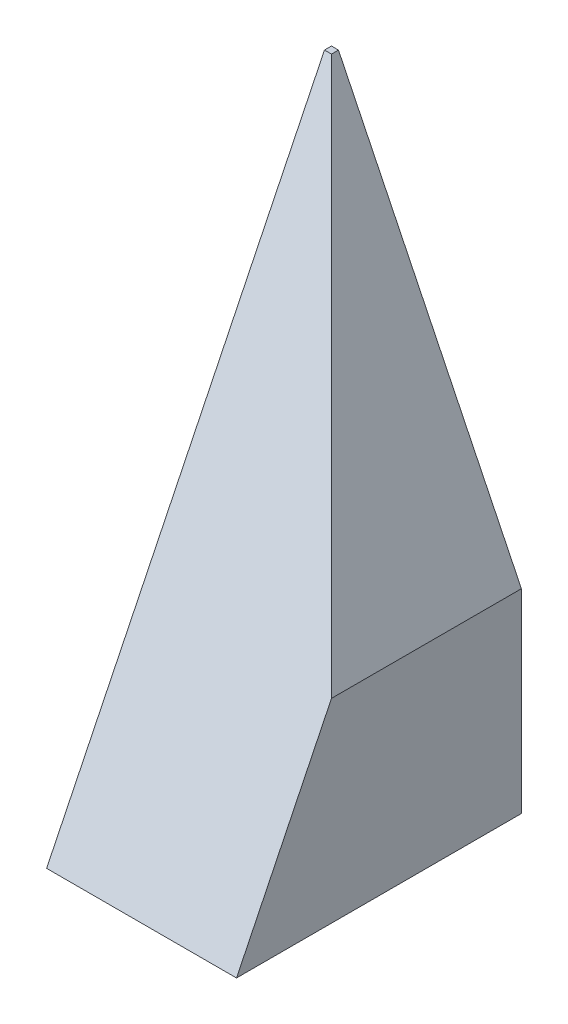
ISO-10303-21;
HEADER;
FILE_DESCRIPTION(('STEP AP214'),'2;1');
FILE_NAME('part.step','',(''),(''),'','','');
FILE_SCHEMA(('AUTOMOTIVE_DESIGN { 1 0 10303 214 1 1 1 1 }'));
ENDSEC;
DATA;
#1=APPLICATION_CONTEXT('core data for automotive mechanical design processes');
#2=APPLICATION_PROTOCOL_DEFINITION('international standard','automotive_design',2000,#1);
#3=PRODUCT_CONTEXT('',#1,'mechanical');
#4=PRODUCT('Part','Part','',(#3));
#5=PRODUCT_RELATED_PRODUCT_CATEGORY('part','',(#4));
#6=PRODUCT_DEFINITION_FORMATION('','',#4);
#7=PRODUCT_DEFINITION_CONTEXT('part definition',#1,'design');
#8=PRODUCT_DEFINITION('design','',#6,#7);
#9=PRODUCT_DEFINITION_SHAPE('','',#8);
#10=(LENGTH_UNIT() NAMED_UNIT(*) SI_UNIT(.MILLI.,.METRE.));
#11=(NAMED_UNIT(*) PLANE_ANGLE_UNIT() SI_UNIT($,.RADIAN.));
#12=(NAMED_UNIT(*) SI_UNIT($,.STERADIAN.) SOLID_ANGLE_UNIT());
#13=UNCERTAINTY_MEASURE_WITH_UNIT(LENGTH_MEASURE(1.E-05),#10,'distance_accuracy_value','');
#14=(GEOMETRIC_REPRESENTATION_CONTEXT(3) GLOBAL_UNCERTAINTY_ASSIGNED_CONTEXT((#13)) GLOBAL_UNIT_ASSIGNED_CONTEXT((#10,
#11,#12)) REPRESENTATION_CONTEXT('',''));
#15=CARTESIAN_POINT('',(0.,0.,0.));
#16=DIRECTION('',(0.,0.,1.));
#17=DIRECTION('',(1.,0.,0.));
#18=AXIS2_PLACEMENT_3D('',#15,#16,#17);
#19=CARTESIAN_POINT('',(0.,60.,0.));
#20=DIRECTION('',(0.,0.,1.));
#21=DIRECTION('',(1.,0.,0.));
#22=AXIS2_PLACEMENT_3D('',#19,#20,#21);
#23=PLANE('',#22);
#24=DIRECTION('',(0.,-1.,0.));
#25=VECTOR('',#24,1.);
#26=CARTESIAN_POINT('',(20.,101.,0.));
#27=LINE('',#26,#25);
#28=CARTESIAN_POINT('',(20.,20.5030384157926,0.));
#29=VERTEX_POINT('',#28);
#30=CARTESIAN_POINT('',(20.,0.,0.));
#31=VERTEX_POINT('',#30);
#32=EDGE_CURVE('E91',#29,#31,#27,.T.);
#33=ORIENTED_EDGE('',*,*,#32,.T.);
#34=DIRECTION('',(-1.,0.,0.));
#35=VECTOR('',#34,1.);
#36=CARTESIAN_POINT('',(0.,0.,0.));
#37=LINE('',#36,#35);
#38=CARTESIAN_POINT('',(0.,0.,0.));
#39=VERTEX_POINT('',#38);
#40=EDGE_CURVE('E100',#31,#39,#37,.T.);
#41=ORIENTED_EDGE('',*,*,#40,.T.);
#42=DIRECTION('',(0.,-1.,0.));
#43=VECTOR('',#42,1.);
#44=CARTESIAN_POINT('',(0.,60.,0.));
#45=LINE('',#44,#43);
#46=CARTESIAN_POINT('',(0.,60.,0.));
#47=VERTEX_POINT('',#46);
#48=EDGE_CURVE('E122',#47,#39,#45,.T.);
#49=ORIENTED_EDGE('',*,*,#48,.F.);
#50=DIRECTION('',(-1.,0.,0.));
#51=VECTOR('',#50,1.);
#52=CARTESIAN_POINT('',(0.,60.,0.));
#53=LINE('',#52,#51);
#54=CARTESIAN_POINT('',(0.736044686048265,60.,0.));
#55=VERTEX_POINT('',#54);
#56=EDGE_CURVE('E117',#55,#47,#53,.T.);
#57=ORIENTED_EDGE('',*,*,#56,.F.);
#58=DIRECTION('',(0.438371146789075,-0.898794046299168,0.));
#59=VECTOR('',#58,1.);
#60=CARTESIAN_POINT('',(0.736044686048265,60.,0.));
#61=LINE('',#60,#59);
#62=EDGE_CURVE('E51',#55,#29,#61,.T.);
#63=ORIENTED_EDGE('',*,*,#62,.T.);
#64=EDGE_LOOP('',(#33,#41,#49,#57,#63));
#65=FACE_BOUND('',#64,.T.);
#66=ADVANCED_FACE('F41',(#65),#23,.F.);
#67=CARTESIAN_POINT('',(0.,0.,0.));
#68=DIRECTION('',(0.,1.,0.));
#69=DIRECTION('',(0.,0.,1.));
#70=AXIS2_PLACEMENT_3D('',#67,#68,#69);
#71=PLANE('',#70);
#72=DIRECTION('',(0.,0.,1.));
#73=VECTOR('',#72,1.);
#74=CARTESIAN_POINT('',(20.,0.,0.));
#75=LINE('',#74,#73);
#76=CARTESIAN_POINT('',(20.,0.,30.));
#77=VERTEX_POINT('',#76);
#78=EDGE_CURVE('E88',#31,#77,#75,.T.);
#79=ORIENTED_EDGE('',*,*,#78,.T.);
#80=DIRECTION('',(1.,0.,0.));
#81=VECTOR('',#80,1.);
#82=CARTESIAN_POINT('',(0.,0.,30.));
#83=LINE('',#82,#81);
#84=CARTESIAN_POINT('',(0.,0.,30.));
#85=VERTEX_POINT('',#84);
#86=EDGE_CURVE('E112',#85,#77,#83,.T.);
#87=ORIENTED_EDGE('',*,*,#86,.F.);
#88=DIRECTION('',(0.,0.,1.));
#89=VECTOR('',#88,1.);
#90=CARTESIAN_POINT('',(0.,0.,0.));
#91=LINE('',#90,#89);
#92=EDGE_CURVE('E109',#39,#85,#91,.T.);
#93=ORIENTED_EDGE('',*,*,#92,.F.);
#94=ORIENTED_EDGE('',*,*,#40,.F.);
#95=EDGE_LOOP('',(#79,#87,#93,#94));
#96=FACE_BOUND('',#95,.T.);
#97=ADVANCED_FACE('F107',(#96),#71,.F.);
#98=CARTESIAN_POINT('',(0.736044686048265,60.,0.));
#99=DIRECTION('',(0.898794046299168,0.438371146789075,0.));
#100=DIRECTION('',(0.,0.,1.));
#101=AXIS2_PLACEMENT_3D('',#98,#99,#100);
#102=PLANE('',#101);
#103=DIRECTION('',(0.401488399504226,-0.823173207853043,0.401488399504226));
#104=VECTOR('',#103,1.);
#105=CARTESIAN_POINT('',(0.617399482859756,60.2432587158824,0.617399482859756));
#106=LINE('',#105,#104);
#107=CARTESIAN_POINT('',(20.,20.5030384157926,20.));
#108=VERTEX_POINT('',#107);
#109=CARTESIAN_POINT('',(0.736044686048265,60.,0.736044686048265));
#110=VERTEX_POINT('',#109);
#111=EDGE_CURVE('E64',#108,#110,#106,.F.);
#112=ORIENTED_EDGE('',*,*,#111,.F.);
#113=DIRECTION('',(0.,0.,-1.));
#114=VECTOR('',#113,1.);
#115=CARTESIAN_POINT('',(20.,20.5030384157926,0.));
#116=LINE('',#115,#114);
#117=EDGE_CURVE('E58',#108,#29,#116,.T.);
#118=ORIENTED_EDGE('',*,*,#117,.T.);
#119=ORIENTED_EDGE('',*,*,#62,.F.);
#120=DIRECTION('',(0.,0.,-1.));
#121=VECTOR('',#120,1.);
#122=CARTESIAN_POINT('',(0.736044686048265,60.,0.));
#123=LINE('',#122,#121);
#124=EDGE_CURVE('E125',#110,#55,#123,.T.);
#125=ORIENTED_EDGE('',*,*,#124,.F.);
#126=EDGE_LOOP('',(#112,#118,#119,#125));
#127=FACE_BOUND('',#126,.T.);
#128=ADVANCED_FACE('F44',(#127),#102,.T.);
#129=CARTESIAN_POINT('',(0.,60.,0.736044686048265));
#130=DIRECTION('',(0.,0.438371146789075,0.898794046299168));
#131=DIRECTION('',(-1.,0.,0.));
#132=AXIS2_PLACEMENT_3D('',#129,#130,#131);
#133=PLANE('',#132);
#134=ORIENTED_EDGE('',*,*,#86,.T.);
#135=DIRECTION('',(0.,0.898794046299168,-0.438371146789075));
#136=VECTOR('',#135,1.);
#137=CARTESIAN_POINT('',(20.,60.,0.736044686048265));
#138=LINE('',#137,#136);
#139=EDGE_CURVE('E11',#77,#108,#138,.T.);
#140=ORIENTED_EDGE('',*,*,#139,.T.);
#141=ORIENTED_EDGE('',*,*,#111,.T.);
#142=DIRECTION('',(1.,0.,0.));
#143=VECTOR('',#142,1.);
#144=CARTESIAN_POINT('',(30.,60.,0.736044686048265));
#145=LINE('',#144,#143);
#146=CARTESIAN_POINT('',(0.,60.,0.736044686048265));
#147=VERTEX_POINT('',#146);
#148=EDGE_CURVE('E128',#147,#110,#145,.T.);
#149=ORIENTED_EDGE('',*,*,#148,.F.);
#150=DIRECTION('',(0.,0.898794046299168,-0.438371146789075));
#151=VECTOR('',#150,1.);
#152=CARTESIAN_POINT('',(0.,60.,0.736044686048265));
#153=LINE('',#152,#151);
#154=EDGE_CURVE('E132',#85,#147,#153,.T.);
#155=ORIENTED_EDGE('',*,*,#154,.F.);
#156=EDGE_LOOP('',(#134,#140,#141,#149,#155));
#157=FACE_BOUND('',#156,.T.);
#158=ADVANCED_FACE('F149',(#157),#133,.T.);
#159=CARTESIAN_POINT('',(0.,60.,0.));
#160=DIRECTION('',(1.,0.,0.));
#161=DIRECTION('',(0.,0.,-1.));
#162=AXIS2_PLACEMENT_3D('',#159,#160,#161);
#163=PLANE('',#162);
#164=ORIENTED_EDGE('',*,*,#92,.T.);
#165=ORIENTED_EDGE('',*,*,#154,.T.);
#166=DIRECTION('',(0.,0.,1.));
#167=VECTOR('',#166,1.);
#168=CARTESIAN_POINT('',(0.,60.,0.));
#169=LINE('',#168,#167);
#170=EDGE_CURVE('E111',#47,#147,#169,.T.);
#171=ORIENTED_EDGE('',*,*,#170,.F.);
#172=ORIENTED_EDGE('',*,*,#48,.T.);
#173=EDGE_LOOP('',(#164,#165,#171,#172));
#174=FACE_BOUND('',#173,.T.);
#175=ADVANCED_FACE('F147',(#174),#163,.F.);
#176=CARTESIAN_POINT('',(0.,60.,0.));
#177=DIRECTION('',(0.,1.,0.));
#178=DIRECTION('',(0.,0.,1.));
#179=AXIS2_PLACEMENT_3D('',#176,#177,#178);
#180=PLANE('',#179);
#181=ORIENTED_EDGE('',*,*,#170,.T.);
#182=ORIENTED_EDGE('',*,*,#148,.T.);
#183=ORIENTED_EDGE('',*,*,#124,.T.);
#184=ORIENTED_EDGE('',*,*,#56,.T.);
#185=EDGE_LOOP('',(#181,#182,#183,#184));
#186=FACE_BOUND('',#185,.T.);
#187=ADVANCED_FACE('F144',(#186),#180,.T.);
#188=CARTESIAN_POINT('',(20.,101.,0.));
#189=DIRECTION('',(1.,0.,0.));
#190=DIRECTION('',(0.,0.,-1.));
#191=AXIS2_PLACEMENT_3D('',#188,#189,#190);
#192=PLANE('',#191);
#193=ORIENTED_EDGE('',*,*,#139,.F.);
#194=ORIENTED_EDGE('',*,*,#78,.F.);
#195=ORIENTED_EDGE('',*,*,#32,.F.);
#196=ORIENTED_EDGE('',*,*,#117,.F.);
#197=EDGE_LOOP('',(#193,#194,#195,#196));
#198=FACE_BOUND('',#197,.T.);
#199=ADVANCED_FACE('F90',(#198),#192,.T.);
#200=CLOSED_SHELL('',(#66,#97,#128,#158,#175,#187,#199));
#201=MANIFOLD_SOLID_BREP('B2',#200);
#202=ADVANCED_BREP_SHAPE_REPRESENTATION('',(#18,#201),#14);
#203=SHAPE_DEFINITION_REPRESENTATION(#9,#202);
ENDSEC;
END-ISO-10303-21;
